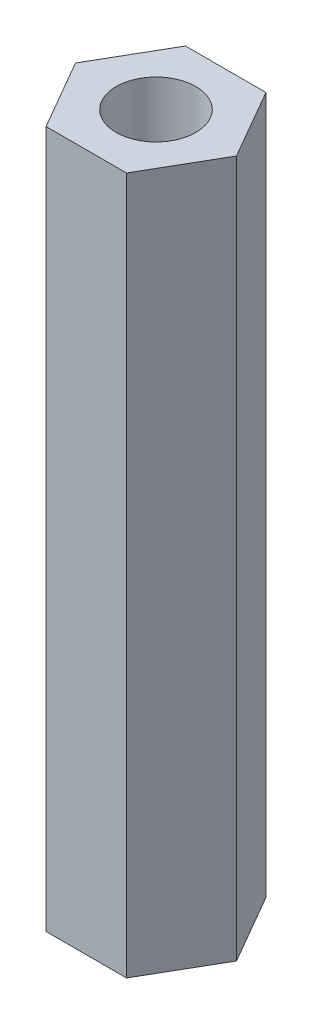
ISO-10303-21;
HEADER;
FILE_DESCRIPTION(('STEP AP214'),'2;1');
FILE_NAME('part.step','',(''),(''),'','','');
FILE_SCHEMA(('AUTOMOTIVE_DESIGN { 1 0 10303 214 1 1 1 1 }'));
ENDSEC;
DATA;
#1=APPLICATION_CONTEXT('core data for automotive mechanical design processes');
#2=APPLICATION_PROTOCOL_DEFINITION('international standard','automotive_design',2000,#1);
#3=PRODUCT_CONTEXT('',#1,'mechanical');
#4=PRODUCT('Part','Part','',(#3));
#5=PRODUCT_RELATED_PRODUCT_CATEGORY('part','',(#4));
#6=PRODUCT_DEFINITION_FORMATION('','',#4);
#7=PRODUCT_DEFINITION_CONTEXT('part definition',#1,'design');
#8=PRODUCT_DEFINITION('design','',#6,#7);
#9=PRODUCT_DEFINITION_SHAPE('','',#8);
#10=(LENGTH_UNIT() NAMED_UNIT(*) SI_UNIT(.MILLI.,.METRE.));
#11=(NAMED_UNIT(*) PLANE_ANGLE_UNIT() SI_UNIT($,.RADIAN.));
#12=(NAMED_UNIT(*) SI_UNIT($,.STERADIAN.) SOLID_ANGLE_UNIT());
#13=UNCERTAINTY_MEASURE_WITH_UNIT(LENGTH_MEASURE(1.E-05),#10,'distance_accuracy_value','');
#14=(GEOMETRIC_REPRESENTATION_CONTEXT(3) GLOBAL_UNCERTAINTY_ASSIGNED_CONTEXT((#13)) GLOBAL_UNIT_ASSIGNED_CONTEXT((#10,
#11,#12)) REPRESENTATION_CONTEXT('',''));
#15=CARTESIAN_POINT('',(0.,0.,0.));
#16=DIRECTION('',(0.,0.,1.));
#17=DIRECTION('',(1.,0.,0.));
#18=AXIS2_PLACEMENT_3D('',#15,#16,#17);
#19=CARTESIAN_POINT('',(0.,35.,0.));
#20=DIRECTION('',(0.,1.,0.));
#21=DIRECTION('',(0.,0.,1.));
#22=AXIS2_PLACEMENT_3D('',#19,#20,#21);
#23=PLANE('',#22);
#24=DIRECTION('',(-0.5,0.,-0.866025403784439));
#25=VECTOR('',#24,1.);
#26=CARTESIAN_POINT('',(4.04145188432738,35.,0.));
#27=LINE('',#26,#25);
#28=CARTESIAN_POINT('',(4.04145188432738,35.,0.));
#29=VERTEX_POINT('',#28);
#30=CARTESIAN_POINT('',(2.02072594216369,35.,-3.5));
#31=VERTEX_POINT('',#30);
#32=EDGE_CURVE('E152',#29,#31,#27,.T.);
#33=ORIENTED_EDGE('',*,*,#32,.T.);
#34=DIRECTION('',(-1.,0.,0.));
#35=VECTOR('',#34,1.);
#36=CARTESIAN_POINT('',(2.02072594216369,35.,-3.5));
#37=LINE('',#36,#35);
#38=CARTESIAN_POINT('',(-2.02072594216369,35.,-3.5));
#39=VERTEX_POINT('',#38);
#40=EDGE_CURVE('E100',#31,#39,#37,.T.);
#41=ORIENTED_EDGE('',*,*,#40,.T.);
#42=DIRECTION('',(-0.5,0.,0.866025403784439));
#43=VECTOR('',#42,1.);
#44=CARTESIAN_POINT('',(-2.02072594216369,35.,-3.5));
#45=LINE('',#44,#43);
#46=CARTESIAN_POINT('',(-4.04145188432738,35.,0.));
#47=VERTEX_POINT('',#46);
#48=EDGE_CURVE('E113',#39,#47,#45,.T.);
#49=ORIENTED_EDGE('',*,*,#48,.T.);
#50=DIRECTION('',(0.5,0.,0.866025403784438));
#51=VECTOR('',#50,1.);
#52=CARTESIAN_POINT('',(-4.04145188432738,35.,0.));
#53=LINE('',#52,#51);
#54=CARTESIAN_POINT('',(-2.02072594216368,35.,3.5));
#55=VERTEX_POINT('',#54);
#56=EDGE_CURVE('E107',#47,#55,#53,.T.);
#57=ORIENTED_EDGE('',*,*,#56,.T.);
#58=DIRECTION('',(1.,0.,0.));
#59=VECTOR('',#58,1.);
#60=CARTESIAN_POINT('',(-2.02072594216368,35.,3.5));
#61=LINE('',#60,#59);
#62=CARTESIAN_POINT('',(2.02072594216369,35.,3.5));
#63=VERTEX_POINT('',#62);
#64=EDGE_CURVE('E111',#55,#63,#61,.T.);
#65=ORIENTED_EDGE('',*,*,#64,.T.);
#66=DIRECTION('',(0.5,0.,-0.866025403784439));
#67=VECTOR('',#66,1.);
#68=CARTESIAN_POINT('',(2.02072594216369,35.,3.5));
#69=LINE('',#68,#67);
#70=EDGE_CURVE('E63',#63,#29,#69,.T.);
#71=ORIENTED_EDGE('',*,*,#70,.T.);
#72=EDGE_LOOP('',(#33,#41,#49,#57,#65,#71));
#73=FACE_BOUND('',#72,.T.);
#74=CARTESIAN_POINT('',(0.,35.,0.));
#75=DIRECTION('',(0.,1.,0.));
#76=DIRECTION('',(0.,0.,1.));
#77=AXIS2_PLACEMENT_3D('',#74,#75,#76);
#78=CIRCLE('',#77,2.);
#79=CARTESIAN_POINT('',(0.,35.,2.));
#80=VERTEX_POINT('',#79);
#81=EDGE_CURVE('E140',#80,#80,#78,.T.);
#82=ORIENTED_EDGE('',*,*,#81,.F.);
#83=EDGE_LOOP('',(#82));
#84=FACE_BOUND('',#83,.T.);
#85=ADVANCED_FACE('F45',(#73,#84),#23,.T.);
#86=CARTESIAN_POINT('',(0.,0.,0.));
#87=DIRECTION('',(0.,1.,0.));
#88=DIRECTION('',(0.,0.,1.));
#89=AXIS2_PLACEMENT_3D('',#86,#87,#88);
#90=PLANE('',#89);
#91=DIRECTION('',(-0.5,0.,-0.866025403784439));
#92=VECTOR('',#91,1.);
#93=CARTESIAN_POINT('',(4.04145188432738,0.,0.));
#94=LINE('',#93,#92);
#95=CARTESIAN_POINT('',(4.04145188432738,0.,0.));
#96=VERTEX_POINT('',#95);
#97=CARTESIAN_POINT('',(2.02072594216369,0.,-3.5));
#98=VERTEX_POINT('',#97);
#99=EDGE_CURVE('E135',#96,#98,#94,.T.);
#100=ORIENTED_EDGE('',*,*,#99,.F.);
#101=DIRECTION('',(0.5,0.,-0.866025403784439));
#102=VECTOR('',#101,1.);
#103=CARTESIAN_POINT('',(2.02072594216369,0.,3.5));
#104=LINE('',#103,#102);
#105=CARTESIAN_POINT('',(2.02072594216369,0.,3.5));
#106=VERTEX_POINT('',#105);
#107=EDGE_CURVE('E92',#106,#96,#104,.T.);
#108=ORIENTED_EDGE('',*,*,#107,.F.);
#109=DIRECTION('',(1.,0.,0.));
#110=VECTOR('',#109,1.);
#111=CARTESIAN_POINT('',(-2.02072594216368,0.,3.5));
#112=LINE('',#111,#110);
#113=CARTESIAN_POINT('',(-2.02072594216368,0.,3.5));
#114=VERTEX_POINT('',#113);
#115=EDGE_CURVE('E86',#114,#106,#112,.T.);
#116=ORIENTED_EDGE('',*,*,#115,.F.);
#117=DIRECTION('',(0.5,0.,0.866025403784438));
#118=VECTOR('',#117,1.);
#119=CARTESIAN_POINT('',(-4.04145188432738,0.,0.));
#120=LINE('',#119,#118);
#121=CARTESIAN_POINT('',(-4.04145188432738,0.,0.));
#122=VERTEX_POINT('',#121);
#123=EDGE_CURVE('E122',#122,#114,#120,.T.);
#124=ORIENTED_EDGE('',*,*,#123,.F.);
#125=DIRECTION('',(-0.5,0.,0.866025403784439));
#126=VECTOR('',#125,1.);
#127=CARTESIAN_POINT('',(-2.02072594216369,0.,-3.5));
#128=LINE('',#127,#126);
#129=CARTESIAN_POINT('',(-2.02072594216369,0.,-3.5));
#130=VERTEX_POINT('',#129);
#131=EDGE_CURVE('E143',#130,#122,#128,.T.);
#132=ORIENTED_EDGE('',*,*,#131,.F.);
#133=DIRECTION('',(-1.,0.,0.));
#134=VECTOR('',#133,1.);
#135=CARTESIAN_POINT('',(2.02072594216369,0.,-3.5));
#136=LINE('',#135,#134);
#137=EDGE_CURVE('E139',#98,#130,#136,.T.);
#138=ORIENTED_EDGE('',*,*,#137,.F.);
#139=EDGE_LOOP('',(#100,#108,#116,#124,#132,#138));
#140=FACE_BOUND('',#139,.T.);
#141=CARTESIAN_POINT('',(0.,0.,0.));
#142=DIRECTION('',(0.,1.,0.));
#143=DIRECTION('',(0.,0.,1.));
#144=AXIS2_PLACEMENT_3D('',#141,#142,#143);
#145=CIRCLE('',#144,2.);
#146=CARTESIAN_POINT('',(0.,0.,2.));
#147=VERTEX_POINT('',#146);
#148=EDGE_CURVE('E249',#147,#147,#145,.T.);
#149=ORIENTED_EDGE('',*,*,#148,.T.);
#150=EDGE_LOOP('',(#149));
#151=FACE_BOUND('',#150,.T.);
#152=ADVANCED_FACE('F165',(#140,#151),#90,.F.);
#153=CARTESIAN_POINT('',(4.04145188432738,35.,0.));
#154=DIRECTION('',(-0.866025403784439,0.,0.5));
#155=DIRECTION('',(0.5,0.,0.866025403784439));
#156=AXIS2_PLACEMENT_3D('',#153,#154,#155);
#157=PLANE('',#156);
#158=ORIENTED_EDGE('',*,*,#99,.T.);
#159=DIRECTION('',(0.,-1.,0.));
#160=VECTOR('',#159,1.);
#161=CARTESIAN_POINT('',(2.02072594216369,35.,-3.5));
#162=LINE('',#161,#160);
#163=EDGE_CURVE('E11',#31,#98,#162,.T.);
#164=ORIENTED_EDGE('',*,*,#163,.F.);
#165=ORIENTED_EDGE('',*,*,#32,.F.);
#166=DIRECTION('',(0.,-1.,0.));
#167=VECTOR('',#166,1.);
#168=CARTESIAN_POINT('',(4.04145188432738,35.,0.));
#169=LINE('',#168,#167);
#170=EDGE_CURVE('E131',#29,#96,#169,.T.);
#171=ORIENTED_EDGE('',*,*,#170,.T.);
#172=EDGE_LOOP('',(#158,#164,#165,#171));
#173=FACE_BOUND('',#172,.T.);
#174=ADVANCED_FACE('F47',(#173),#157,.F.);
#175=CARTESIAN_POINT('',(2.02072594216369,35.,-3.5));
#176=DIRECTION('',(0.,0.,1.));
#177=DIRECTION('',(1.,0.,0.));
#178=AXIS2_PLACEMENT_3D('',#175,#176,#177);
#179=PLANE('',#178);
#180=ORIENTED_EDGE('',*,*,#137,.T.);
#181=DIRECTION('',(0.,-1.,0.));
#182=VECTOR('',#181,1.);
#183=CARTESIAN_POINT('',(-2.02072594216369,35.,-3.5));
#184=LINE('',#183,#182);
#185=EDGE_CURVE('E55',#39,#130,#184,.T.);
#186=ORIENTED_EDGE('',*,*,#185,.F.);
#187=ORIENTED_EDGE('',*,*,#40,.F.);
#188=ORIENTED_EDGE('',*,*,#163,.T.);
#189=EDGE_LOOP('',(#180,#186,#187,#188));
#190=FACE_BOUND('',#189,.T.);
#191=ADVANCED_FACE('F190',(#190),#179,.F.);
#192=CARTESIAN_POINT('',(-2.02072594216369,35.,-3.5));
#193=DIRECTION('',(0.866025403784439,0.,0.5));
#194=DIRECTION('',(0.5,0.,-0.866025403784439));
#195=AXIS2_PLACEMENT_3D('',#192,#193,#194);
#196=PLANE('',#195);
#197=ORIENTED_EDGE('',*,*,#131,.T.);
#198=DIRECTION('',(0.,-1.,0.));
#199=VECTOR('',#198,1.);
#200=CARTESIAN_POINT('',(-4.04145188432738,35.,0.));
#201=LINE('',#200,#199);
#202=EDGE_CURVE('E124',#47,#122,#201,.T.);
#203=ORIENTED_EDGE('',*,*,#202,.F.);
#204=ORIENTED_EDGE('',*,*,#48,.F.);
#205=ORIENTED_EDGE('',*,*,#185,.T.);
#206=EDGE_LOOP('',(#197,#203,#204,#205));
#207=FACE_BOUND('',#206,.T.);
#208=ADVANCED_FACE('F162',(#207),#196,.F.);
#209=CARTESIAN_POINT('',(-4.04145188432738,35.,0.));
#210=DIRECTION('',(0.866025403784438,0.,-0.5));
#211=DIRECTION('',(-0.5,0.,-0.866025403784438));
#212=AXIS2_PLACEMENT_3D('',#209,#210,#211);
#213=PLANE('',#212);
#214=ORIENTED_EDGE('',*,*,#123,.T.);
#215=DIRECTION('',(0.,-1.,0.));
#216=VECTOR('',#215,1.);
#217=CARTESIAN_POINT('',(-2.02072594216368,35.,3.5));
#218=LINE('',#217,#216);
#219=EDGE_CURVE('E119',#55,#114,#218,.T.);
#220=ORIENTED_EDGE('',*,*,#219,.F.);
#221=ORIENTED_EDGE('',*,*,#56,.F.);
#222=ORIENTED_EDGE('',*,*,#202,.T.);
#223=EDGE_LOOP('',(#214,#220,#221,#222));
#224=FACE_BOUND('',#223,.T.);
#225=ADVANCED_FACE('F120',(#224),#213,.F.);
#226=CARTESIAN_POINT('',(-2.02072594216368,35.,3.5));
#227=DIRECTION('',(0.,0.,-1.));
#228=DIRECTION('',(-1.,0.,0.));
#229=AXIS2_PLACEMENT_3D('',#226,#227,#228);
#230=PLANE('',#229);
#231=ORIENTED_EDGE('',*,*,#115,.T.);
#232=DIRECTION('',(0.,-1.,0.));
#233=VECTOR('',#232,1.);
#234=CARTESIAN_POINT('',(2.02072594216369,35.,3.5));
#235=LINE('',#234,#233);
#236=EDGE_CURVE('E125',#63,#106,#235,.T.);
#237=ORIENTED_EDGE('',*,*,#236,.F.);
#238=ORIENTED_EDGE('',*,*,#64,.F.);
#239=ORIENTED_EDGE('',*,*,#219,.T.);
#240=EDGE_LOOP('',(#231,#237,#238,#239));
#241=FACE_BOUND('',#240,.T.);
#242=ADVANCED_FACE('F127',(#241),#230,.F.);
#243=CARTESIAN_POINT('',(2.02072594216369,35.,3.5));
#244=DIRECTION('',(-0.866025403784439,0.,-0.5));
#245=DIRECTION('',(-0.5,0.,0.866025403784439));
#246=AXIS2_PLACEMENT_3D('',#243,#244,#245);
#247=PLANE('',#246);
#248=ORIENTED_EDGE('',*,*,#107,.T.);
#249=ORIENTED_EDGE('',*,*,#170,.F.);
#250=ORIENTED_EDGE('',*,*,#70,.F.);
#251=ORIENTED_EDGE('',*,*,#236,.T.);
#252=EDGE_LOOP('',(#248,#249,#250,#251));
#253=FACE_BOUND('',#252,.T.);
#254=ADVANCED_FACE('F170',(#253),#247,.F.);
#255=CARTESIAN_POINT('',(0.,35.,0.));
#256=DIRECTION('',(0.,-1.,0.));
#257=DIRECTION('',(0.,0.,-1.));
#258=AXIS2_PLACEMENT_3D('',#255,#256,#257);
#259=CYLINDRICAL_SURFACE('',#258,2.);
#260=ORIENTED_EDGE('',*,*,#81,.T.);
#261=EDGE_LOOP('',(#260));
#262=FACE_BOUND('',#261,.T.);
#263=ORIENTED_EDGE('',*,*,#148,.F.);
#264=EDGE_LOOP('',(#263));
#265=FACE_BOUND('',#264,.T.);
#266=ADVANCED_FACE('F172',(#262,#265),#259,.F.);
#267=CLOSED_SHELL('',(#85,#152,#174,#191,#208,#225,#242,#254,#266));
#268=MANIFOLD_SOLID_BREP('B2',#267);
#269=ADVANCED_BREP_SHAPE_REPRESENTATION('',(#18,#268),#14);
#270=SHAPE_DEFINITION_REPRESENTATION(#9,#269);
ENDSEC;
END-ISO-10303-21;
